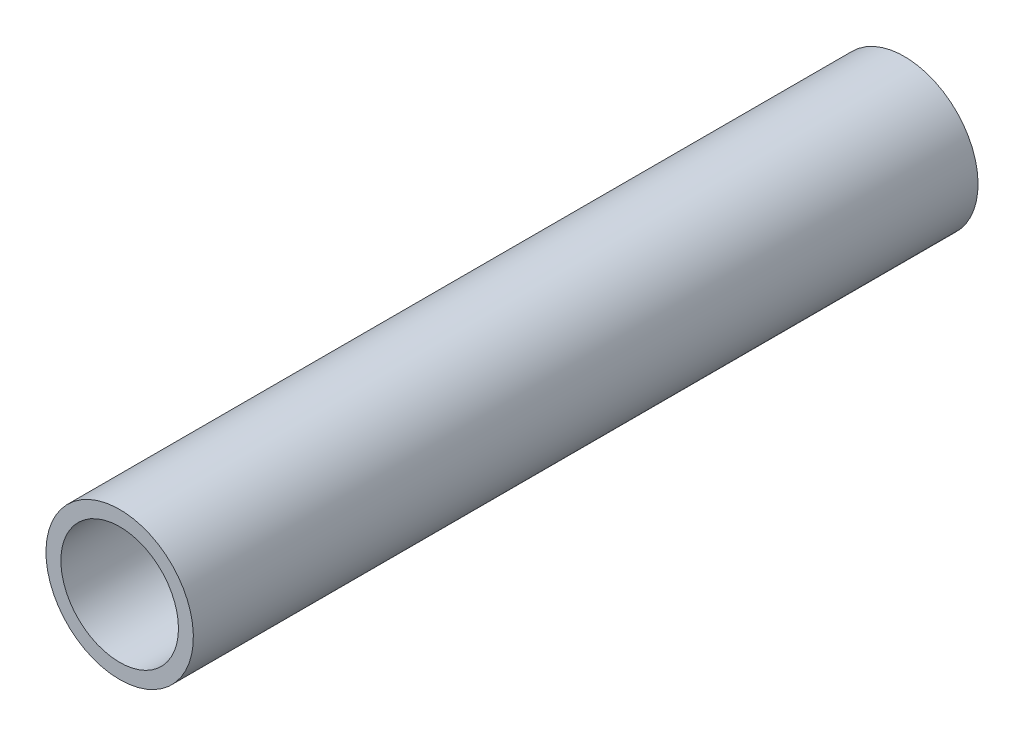
ISO-10303-21;
HEADER;
FILE_DESCRIPTION(('STEP AP214'),'2;1');
FILE_NAME('part.step','',(''),(''),'','','');
FILE_SCHEMA(('AUTOMOTIVE_DESIGN { 1 0 10303 214 1 1 1 1 }'));
ENDSEC;
DATA;
#1=APPLICATION_CONTEXT('core data for automotive mechanical design processes');
#2=APPLICATION_PROTOCOL_DEFINITION('international standard','automotive_design',2000,#1);
#3=PRODUCT_CONTEXT('',#1,'mechanical');
#4=PRODUCT('Part','Part','',(#3));
#5=PRODUCT_RELATED_PRODUCT_CATEGORY('part','',(#4));
#6=PRODUCT_DEFINITION_FORMATION('','',#4);
#7=PRODUCT_DEFINITION_CONTEXT('part definition',#1,'design');
#8=PRODUCT_DEFINITION('design','',#6,#7);
#9=PRODUCT_DEFINITION_SHAPE('','',#8);
#10=(LENGTH_UNIT() NAMED_UNIT(*) SI_UNIT(.MILLI.,.METRE.));
#11=(NAMED_UNIT(*) PLANE_ANGLE_UNIT() SI_UNIT($,.RADIAN.));
#12=(NAMED_UNIT(*) SI_UNIT($,.STERADIAN.) SOLID_ANGLE_UNIT());
#13=UNCERTAINTY_MEASURE_WITH_UNIT(LENGTH_MEASURE(1.E-05),#10,'distance_accuracy_value','');
#14=(GEOMETRIC_REPRESENTATION_CONTEXT(3) GLOBAL_UNCERTAINTY_ASSIGNED_CONTEXT((#13)) GLOBAL_UNIT_ASSIGNED_CONTEXT((#10,
#11,#12)) REPRESENTATION_CONTEXT('',''));
#15=CARTESIAN_POINT('',(0.,0.,0.));
#16=DIRECTION('',(0.,0.,1.));
#17=DIRECTION('',(1.,0.,0.));
#18=AXIS2_PLACEMENT_3D('',#15,#16,#17);
#19=CARTESIAN_POINT('',(0.,0.,0.));
#20=DIRECTION('',(0.,0.,1.));
#21=DIRECTION('',(1.,0.,0.));
#22=AXIS2_PLACEMENT_3D('',#19,#20,#21);
#23=CYLINDRICAL_SURFACE('',#22,13.3223);
#24=CARTESIAN_POINT('',(0.,0.,177.8));
#25=DIRECTION('',(0.,0.,1.));
#26=DIRECTION('',(1.,0.,0.));
#27=AXIS2_PLACEMENT_3D('',#24,#25,#26);
#28=CIRCLE('',#27,13.3223);
#29=CARTESIAN_POINT('',(13.3223,0.,177.8));
#30=VERTEX_POINT('',#29);
#31=EDGE_CURVE('E9',#30,#30,#28,.T.);
#32=ORIENTED_EDGE('',*,*,#31,.T.);
#33=EDGE_LOOP('',(#32));
#34=FACE_BOUND('',#33,.T.);
#35=CARTESIAN_POINT('',(0.,0.,0.));
#36=DIRECTION('',(0.,0.,1.));
#37=DIRECTION('',(1.,0.,0.));
#38=AXIS2_PLACEMENT_3D('',#35,#36,#37);
#39=CIRCLE('',#38,13.3223);
#40=CARTESIAN_POINT('',(13.3223,0.,0.));
#41=VERTEX_POINT('',#40);
#42=EDGE_CURVE('E27',#41,#41,#39,.T.);
#43=ORIENTED_EDGE('',*,*,#42,.F.);
#44=EDGE_LOOP('',(#43));
#45=FACE_BOUND('',#44,.T.);
#46=ADVANCED_FACE('F14',(#34,#45),#23,.F.);
#47=CARTESIAN_POINT('',(0.,0.,0.));
#48=DIRECTION('',(0.,0.,1.));
#49=DIRECTION('',(1.,0.,0.));
#50=AXIS2_PLACEMENT_3D('',#47,#48,#49);
#51=CYLINDRICAL_SURFACE('',#50,16.7005);
#52=CARTESIAN_POINT('',(0.,0.,177.8));
#53=DIRECTION('',(0.,0.,-1.));
#54=DIRECTION('',(0.,-1.,0.));
#55=AXIS2_PLACEMENT_3D('',#52,#53,#54);
#56=CIRCLE('',#55,16.7005);
#57=CARTESIAN_POINT('',(0.,-16.7005,177.8));
#58=VERTEX_POINT('',#57);
#59=EDGE_CURVE('E21',#58,#58,#56,.T.);
#60=ORIENTED_EDGE('',*,*,#59,.T.);
#61=EDGE_LOOP('',(#60));
#62=FACE_BOUND('',#61,.T.);
#63=CARTESIAN_POINT('',(0.,0.,0.));
#64=DIRECTION('',(0.,0.,-1.));
#65=DIRECTION('',(0.,-1.,0.));
#66=AXIS2_PLACEMENT_3D('',#63,#64,#65);
#67=CIRCLE('',#66,16.7005);
#68=CARTESIAN_POINT('',(0.,-16.7005,0.));
#69=VERTEX_POINT('',#68);
#70=EDGE_CURVE('E17',#69,#69,#67,.T.);
#71=ORIENTED_EDGE('',*,*,#70,.F.);
#72=EDGE_LOOP('',(#71));
#73=FACE_BOUND('',#72,.T.);
#74=ADVANCED_FACE('F36',(#62,#73),#51,.T.);
#75=CARTESIAN_POINT('',(0.,0.,0.));
#76=DIRECTION('',(0.,0.,1.));
#77=DIRECTION('',(1.,0.,0.));
#78=AXIS2_PLACEMENT_3D('',#75,#76,#77);
#79=PLANE('',#78);
#80=ORIENTED_EDGE('',*,*,#70,.T.);
#81=EDGE_LOOP('',(#80));
#82=FACE_BOUND('',#81,.T.);
#83=ORIENTED_EDGE('',*,*,#42,.T.);
#84=EDGE_LOOP('',(#83));
#85=FACE_BOUND('',#84,.T.);
#86=ADVANCED_FACE('F34',(#82,#85),#79,.F.);
#87=CARTESIAN_POINT('',(0.,0.,177.8));
#88=DIRECTION('',(0.,0.,1.));
#89=DIRECTION('',(1.,0.,0.));
#90=AXIS2_PLACEMENT_3D('',#87,#88,#89);
#91=PLANE('',#90);
#92=ORIENTED_EDGE('',*,*,#59,.F.);
#93=EDGE_LOOP('',(#92));
#94=FACE_BOUND('',#93,.T.);
#95=ORIENTED_EDGE('',*,*,#31,.F.);
#96=EDGE_LOOP('',(#95));
#97=FACE_BOUND('',#96,.T.);
#98=ADVANCED_FACE('F44',(#94,#97),#91,.T.);
#99=CLOSED_SHELL('',(#46,#74,#86,#98));
#100=MANIFOLD_SOLID_BREP('B1',#99);
#101=ADVANCED_BREP_SHAPE_REPRESENTATION('',(#18,#100),#14);
#102=SHAPE_DEFINITION_REPRESENTATION(#9,#101);
ENDSEC;
END-ISO-10303-21;
